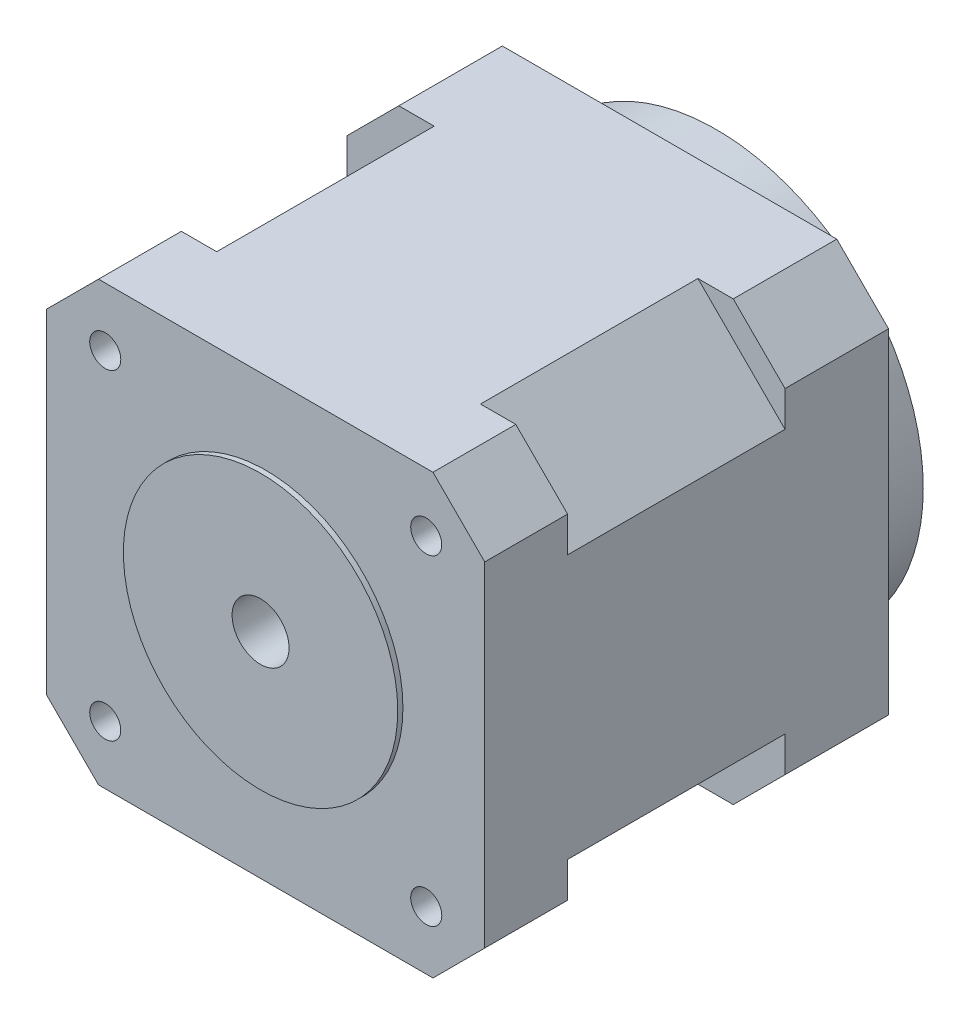
ISO-10303-21;
HEADER;
FILE_DESCRIPTION(('STEP AP214'),'2;1');
FILE_NAME('part.step','',(''),(''),'','','');
FILE_SCHEMA(('AUTOMOTIVE_DESIGN { 1 0 10303 214 1 1 1 1 }'));
ENDSEC;
DATA;
#1=APPLICATION_CONTEXT('core data for automotive mechanical design processes');
#2=APPLICATION_PROTOCOL_DEFINITION('international standard','automotive_design',2000,#1);
#3=PRODUCT_CONTEXT('',#1,'mechanical');
#4=PRODUCT('Part','Part','',(#3));
#5=PRODUCT_RELATED_PRODUCT_CATEGORY('part','',(#4));
#6=PRODUCT_DEFINITION_FORMATION('','',#4);
#7=PRODUCT_DEFINITION_CONTEXT('part definition',#1,'design');
#8=PRODUCT_DEFINITION('design','',#6,#7);
#9=PRODUCT_DEFINITION_SHAPE('','',#8);
#10=(LENGTH_UNIT() NAMED_UNIT(*) SI_UNIT(.MILLI.,.METRE.));
#11=(NAMED_UNIT(*) PLANE_ANGLE_UNIT() SI_UNIT($,.RADIAN.));
#12=(NAMED_UNIT(*) SI_UNIT($,.STERADIAN.) SOLID_ANGLE_UNIT());
#13=UNCERTAINTY_MEASURE_WITH_UNIT(LENGTH_MEASURE(1.E-05),#10,'distance_accuracy_value','');
#14=(GEOMETRIC_REPRESENTATION_CONTEXT(3) GLOBAL_UNCERTAINTY_ASSIGNED_CONTEXT((#13)) GLOBAL_UNIT_ASSIGNED_CONTEXT((#10,
#11,#12)) REPRESENTATION_CONTEXT('',''));
#15=CARTESIAN_POINT('',(0.,0.,0.));
#16=DIRECTION('',(0.,0.,1.));
#17=DIRECTION('',(1.,0.,0.));
#18=AXIS2_PLACEMENT_3D('',#15,#16,#17);
#19=CARTESIAN_POINT('',(21.15,-21.15,39.));
#20=DIRECTION('',(-1.,0.,0.));
#21=DIRECTION('',(0.,0.,1.));
#22=AXIS2_PLACEMENT_3D('',#19,#20,#21);
#23=PLANE('',#22);
#24=DIRECTION('',(0.,1.,0.));
#25=VECTOR('',#24,1.);
#26=CARTESIAN_POINT('',(21.15,21.15,10.));
#27=LINE('',#26,#25);
#28=CARTESIAN_POINT('',(21.15,12.7386403449672,10.));
#29=VERTEX_POINT('',#28);
#30=CARTESIAN_POINT('',(21.15,16.15,10.));
#31=VERTEX_POINT('',#30);
#32=EDGE_CURVE('E259',#29,#31,#27,.T.);
#33=ORIENTED_EDGE('',*,*,#32,.F.);
#34=DIRECTION('',(0.,0.,1.));
#35=VECTOR('',#34,1.);
#36=CARTESIAN_POINT('',(21.15,12.7386403449672,10.));
#37=LINE('',#36,#35);
#38=CARTESIAN_POINT('',(21.15,12.7386403449672,31.));
#39=VERTEX_POINT('',#38);
#40=EDGE_CURVE('E252',#29,#39,#37,.T.);
#41=ORIENTED_EDGE('',*,*,#40,.T.);
#42=DIRECTION('',(0.,1.,0.));
#43=VECTOR('',#42,1.);
#44=CARTESIAN_POINT('',(21.15,21.15,31.));
#45=LINE('',#44,#43);
#46=CARTESIAN_POINT('',(21.15,16.15,31.));
#47=VERTEX_POINT('',#46);
#48=EDGE_CURVE('E234',#39,#47,#45,.T.);
#49=ORIENTED_EDGE('',*,*,#48,.T.);
#50=DIRECTION('',(0.,0.,1.));
#51=VECTOR('',#50,1.);
#52=CARTESIAN_POINT('',(21.15,16.15,39.));
#53=LINE('',#52,#51);
#54=CARTESIAN_POINT('',(21.15,16.15,39.));
#55=VERTEX_POINT('',#54);
#56=EDGE_CURVE('E319',#47,#55,#53,.T.);
#57=ORIENTED_EDGE('',*,*,#56,.T.);
#58=DIRECTION('',(0.,1.,0.));
#59=VECTOR('',#58,1.);
#60=CARTESIAN_POINT('',(21.15,-21.15,39.));
#61=LINE('',#60,#59);
#62=CARTESIAN_POINT('',(21.15,-16.15,39.));
#63=VERTEX_POINT('',#62);
#64=EDGE_CURVE('E306',#63,#55,#61,.T.);
#65=ORIENTED_EDGE('',*,*,#64,.F.);
#66=DIRECTION('',(0.,0.,-1.));
#67=VECTOR('',#66,1.);
#68=CARTESIAN_POINT('',(21.15,-16.15,39.));
#69=LINE('',#68,#67);
#70=CARTESIAN_POINT('',(21.15,-16.15,31.));
#71=VERTEX_POINT('',#70);
#72=EDGE_CURVE('E334',#63,#71,#69,.T.);
#73=ORIENTED_EDGE('',*,*,#72,.T.);
#74=DIRECTION('',(0.,1.,0.));
#75=VECTOR('',#74,1.);
#76=CARTESIAN_POINT('',(21.15,-12.7386403449672,31.));
#77=LINE('',#76,#75);
#78=CARTESIAN_POINT('',(21.15,-12.7386403449672,31.));
#79=VERTEX_POINT('',#78);
#80=EDGE_CURVE('E66',#71,#79,#77,.T.);
#81=ORIENTED_EDGE('',*,*,#80,.T.);
#82=DIRECTION('',(0.,0.,1.));
#83=VECTOR('',#82,1.);
#84=CARTESIAN_POINT('',(21.15,-12.7386403449672,10.));
#85=LINE('',#84,#83);
#86=CARTESIAN_POINT('',(21.15,-12.7386403449672,10.));
#87=VERTEX_POINT('',#86);
#88=EDGE_CURVE('E228',#87,#79,#85,.T.);
#89=ORIENTED_EDGE('',*,*,#88,.F.);
#90=DIRECTION('',(0.,1.,0.));
#91=VECTOR('',#90,1.);
#92=CARTESIAN_POINT('',(21.15,-12.7386403449672,10.));
#93=LINE('',#92,#91);
#94=CARTESIAN_POINT('',(21.15,-16.15,10.));
#95=VERTEX_POINT('',#94);
#96=EDGE_CURVE('E245',#95,#87,#93,.T.);
#97=ORIENTED_EDGE('',*,*,#96,.F.);
#98=CARTESIAN_POINT('',(21.15,-16.15,0.));
#99=VERTEX_POINT('',#98);
#100=EDGE_CURVE('E333',#95,#99,#69,.T.);
#101=ORIENTED_EDGE('',*,*,#100,.T.);
#102=DIRECTION('',(0.,1.,0.));
#103=VECTOR('',#102,1.);
#104=CARTESIAN_POINT('',(21.15,-21.15,0.));
#105=LINE('',#104,#103);
#106=CARTESIAN_POINT('',(21.15,16.15,0.));
#107=VERTEX_POINT('',#106);
#108=EDGE_CURVE('E303',#99,#107,#105,.T.);
#109=ORIENTED_EDGE('',*,*,#108,.T.);
#110=EDGE_CURVE('E330',#107,#31,#53,.T.);
#111=ORIENTED_EDGE('',*,*,#110,.T.);
#112=EDGE_LOOP('',(#33,#41,#49,#57,#65,#73,#81,#89,#97,#101,#109,#111));
#113=FACE_BOUND('',#112,.T.);
#114=ADVANCED_FACE('F48',(#113),#23,.F.);
#115=CARTESIAN_POINT('',(-21.15,21.15,39.));
#116=DIRECTION('',(0.,-1.,0.));
#117=DIRECTION('',(0.,0.,-1.));
#118=AXIS2_PLACEMENT_3D('',#115,#116,#117);
#119=PLANE('',#118);
#120=DIRECTION('',(-1.,0.,0.));
#121=VECTOR('',#120,1.);
#122=CARTESIAN_POINT('',(12.7386403449672,21.15,10.));
#123=LINE('',#122,#121);
#124=CARTESIAN_POINT('',(16.15,21.15,10.));
#125=VERTEX_POINT('',#124);
#126=CARTESIAN_POINT('',(12.7386403449672,21.15,10.));
#127=VERTEX_POINT('',#126);
#128=EDGE_CURVE('E263',#125,#127,#123,.T.);
#129=ORIENTED_EDGE('',*,*,#128,.F.);
#130=DIRECTION('',(0.,0.,-1.));
#131=VECTOR('',#130,1.);
#132=CARTESIAN_POINT('',(16.15,21.15,39.));
#133=LINE('',#132,#131);
#134=CARTESIAN_POINT('',(16.15,21.15,0.));
#135=VERTEX_POINT('',#134);
#136=EDGE_CURVE('E368',#125,#135,#133,.T.);
#137=ORIENTED_EDGE('',*,*,#136,.T.);
#138=DIRECTION('',(-1.,0.,0.));
#139=VECTOR('',#138,1.);
#140=CARTESIAN_POINT('',(-21.15,21.15,0.));
#141=LINE('',#140,#139);
#142=CARTESIAN_POINT('',(-16.15,21.15,0.));
#143=VERTEX_POINT('',#142);
#144=EDGE_CURVE('E322',#135,#143,#141,.T.);
#145=ORIENTED_EDGE('',*,*,#144,.T.);
#146=DIRECTION('',(0.,0.,1.));
#147=VECTOR('',#146,1.);
#148=CARTESIAN_POINT('',(-16.15,21.15,39.));
#149=LINE('',#148,#147);
#150=CARTESIAN_POINT('',(-16.15,21.15,10.));
#151=VERTEX_POINT('',#150);
#152=EDGE_CURVE('E373',#143,#151,#149,.T.);
#153=ORIENTED_EDGE('',*,*,#152,.T.);
#154=DIRECTION('',(-1.,0.,0.));
#155=VECTOR('',#154,1.);
#156=CARTESIAN_POINT('',(-12.7386403449672,21.15,10.));
#157=LINE('',#156,#155);
#158=CARTESIAN_POINT('',(-12.7386403449672,21.15,10.));
#159=VERTEX_POINT('',#158);
#160=EDGE_CURVE('E285',#159,#151,#157,.T.);
#161=ORIENTED_EDGE('',*,*,#160,.F.);
#162=DIRECTION('',(0.,0.,1.));
#163=VECTOR('',#162,1.);
#164=CARTESIAN_POINT('',(-12.7386403449672,21.15,10.));
#165=LINE('',#164,#163);
#166=CARTESIAN_POINT('',(-12.7386403449672,21.15,31.));
#167=VERTEX_POINT('',#166);
#168=EDGE_CURVE('E300',#159,#167,#165,.T.);
#169=ORIENTED_EDGE('',*,*,#168,.T.);
#170=DIRECTION('',(-1.,0.,0.));
#171=VECTOR('',#170,1.);
#172=CARTESIAN_POINT('',(-12.7386403449672,21.15,31.));
#173=LINE('',#172,#171);
#174=CARTESIAN_POINT('',(-16.15,21.15,31.));
#175=VERTEX_POINT('',#174);
#176=EDGE_CURVE('E219',#167,#175,#173,.T.);
#177=ORIENTED_EDGE('',*,*,#176,.T.);
#178=CARTESIAN_POINT('',(-16.15,21.15,39.));
#179=VERTEX_POINT('',#178);
#180=EDGE_CURVE('E372',#175,#179,#149,.T.);
#181=ORIENTED_EDGE('',*,*,#180,.T.);
#182=DIRECTION('',(-1.,0.,0.));
#183=VECTOR('',#182,1.);
#184=CARTESIAN_POINT('',(-21.15,21.15,39.));
#185=LINE('',#184,#183);
#186=CARTESIAN_POINT('',(16.15,21.15,39.));
#187=VERTEX_POINT('',#186);
#188=EDGE_CURVE('E309',#187,#179,#185,.T.);
#189=ORIENTED_EDGE('',*,*,#188,.F.);
#190=CARTESIAN_POINT('',(16.15,21.15,31.));
#191=VERTEX_POINT('',#190);
#192=EDGE_CURVE('E369',#187,#191,#133,.T.);
#193=ORIENTED_EDGE('',*,*,#192,.T.);
#194=DIRECTION('',(-1.,0.,0.));
#195=VECTOR('',#194,1.);
#196=CARTESIAN_POINT('',(12.7386403449672,21.15,31.));
#197=LINE('',#196,#195);
#198=CARTESIAN_POINT('',(12.7386403449672,21.15,31.));
#199=VERTEX_POINT('',#198);
#200=EDGE_CURVE('E239',#191,#199,#197,.T.);
#201=ORIENTED_EDGE('',*,*,#200,.T.);
#202=DIRECTION('',(0.,0.,1.));
#203=VECTOR('',#202,1.);
#204=CARTESIAN_POINT('',(12.7386403449672,21.15,10.));
#205=LINE('',#204,#203);
#206=EDGE_CURVE('E248',#127,#199,#205,.T.);
#207=ORIENTED_EDGE('',*,*,#206,.F.);
#208=EDGE_LOOP('',(#129,#137,#145,#153,#161,#169,#177,#181,#189,#193,#201,#207));
#209=FACE_BOUND('',#208,.T.);
#210=ADVANCED_FACE('F450',(#209),#119,.F.);
#211=CARTESIAN_POINT('',(-21.15,-21.15,39.));
#212=DIRECTION('',(1.,0.,0.));
#213=DIRECTION('',(0.,0.,-1.));
#214=AXIS2_PLACEMENT_3D('',#211,#212,#213);
#215=PLANE('',#214);
#216=DIRECTION('',(0.,-1.,0.));
#217=VECTOR('',#216,1.);
#218=CARTESIAN_POINT('',(-21.15,-21.15,10.));
#219=LINE('',#218,#217);
#220=CARTESIAN_POINT('',(-21.15,-12.7386403449672,10.));
#221=VERTEX_POINT('',#220);
#222=CARTESIAN_POINT('',(-21.15,-16.15,10.));
#223=VERTEX_POINT('',#222);
#224=EDGE_CURVE('E277',#221,#223,#219,.T.);
#225=ORIENTED_EDGE('',*,*,#224,.F.);
#226=DIRECTION('',(0.,0.,1.));
#227=VECTOR('',#226,1.);
#228=CARTESIAN_POINT('',(-21.15,-12.7386403449672,10.));
#229=LINE('',#228,#227);
#230=CARTESIAN_POINT('',(-21.15,-12.7386403449672,31.));
#231=VERTEX_POINT('',#230);
#232=EDGE_CURVE('E270',#221,#231,#229,.T.);
#233=ORIENTED_EDGE('',*,*,#232,.T.);
#234=DIRECTION('',(0.,-1.,0.));
#235=VECTOR('',#234,1.);
#236=CARTESIAN_POINT('',(-21.15,-21.15,31.));
#237=LINE('',#236,#235);
#238=CARTESIAN_POINT('',(-21.15,-16.15,31.));
#239=VERTEX_POINT('',#238);
#240=EDGE_CURVE('E255',#231,#239,#237,.T.);
#241=ORIENTED_EDGE('',*,*,#240,.T.);
#242=DIRECTION('',(0.,0.,1.));
#243=VECTOR('',#242,1.);
#244=CARTESIAN_POINT('',(-21.15,-16.15,39.));
#245=LINE('',#244,#243);
#246=CARTESIAN_POINT('',(-21.15,-16.15,39.));
#247=VERTEX_POINT('',#246);
#248=EDGE_CURVE('E364',#239,#247,#245,.T.);
#249=ORIENTED_EDGE('',*,*,#248,.T.);
#250=DIRECTION('',(0.,-1.,0.));
#251=VECTOR('',#250,1.);
#252=CARTESIAN_POINT('',(-21.15,-21.15,39.));
#253=LINE('',#252,#251);
#254=CARTESIAN_POINT('',(-21.15,16.15,39.));
#255=VERTEX_POINT('',#254);
#256=EDGE_CURVE('E313',#255,#247,#253,.T.);
#257=ORIENTED_EDGE('',*,*,#256,.F.);
#258=DIRECTION('',(0.,0.,-1.));
#259=VECTOR('',#258,1.);
#260=CARTESIAN_POINT('',(-21.15,16.15,39.));
#261=LINE('',#260,#259);
#262=CARTESIAN_POINT('',(-21.15,16.15,31.));
#263=VERTEX_POINT('',#262);
#264=EDGE_CURVE('E361',#255,#263,#261,.T.);
#265=ORIENTED_EDGE('',*,*,#264,.T.);
#266=DIRECTION('',(0.,-1.,0.));
#267=VECTOR('',#266,1.);
#268=CARTESIAN_POINT('',(-21.15,21.15,31.));
#269=LINE('',#268,#267);
#270=CARTESIAN_POINT('',(-21.15,12.7386403449672,31.));
#271=VERTEX_POINT('',#270);
#272=EDGE_CURVE('E295',#263,#271,#269,.T.);
#273=ORIENTED_EDGE('',*,*,#272,.T.);
#274=DIRECTION('',(0.,0.,1.));
#275=VECTOR('',#274,1.);
#276=CARTESIAN_POINT('',(-21.15,12.7386403449672,10.));
#277=LINE('',#276,#275);
#278=CARTESIAN_POINT('',(-21.15,12.7386403449672,10.));
#279=VERTEX_POINT('',#278);
#280=EDGE_CURVE('E292',#279,#271,#277,.T.);
#281=ORIENTED_EDGE('',*,*,#280,.F.);
#282=DIRECTION('',(0.,-1.,0.));
#283=VECTOR('',#282,1.);
#284=CARTESIAN_POINT('',(-21.15,21.15,10.));
#285=LINE('',#284,#283);
#286=CARTESIAN_POINT('',(-21.15,16.15,10.));
#287=VERTEX_POINT('',#286);
#288=EDGE_CURVE('E287',#287,#279,#285,.T.);
#289=ORIENTED_EDGE('',*,*,#288,.F.);
#290=CARTESIAN_POINT('',(-21.15,16.15,0.));
#291=VERTEX_POINT('',#290);
#292=EDGE_CURVE('E360',#287,#291,#261,.T.);
#293=ORIENTED_EDGE('',*,*,#292,.T.);
#294=DIRECTION('',(0.,-1.,0.));
#295=VECTOR('',#294,1.);
#296=CARTESIAN_POINT('',(-21.15,-21.15,0.));
#297=LINE('',#296,#295);
#298=CARTESIAN_POINT('',(-21.15,-16.15,0.));
#299=VERTEX_POINT('',#298);
#300=EDGE_CURVE('E325',#291,#299,#297,.T.);
#301=ORIENTED_EDGE('',*,*,#300,.T.);
#302=EDGE_CURVE('E365',#299,#223,#245,.T.);
#303=ORIENTED_EDGE('',*,*,#302,.T.);
#304=EDGE_LOOP('',(#225,#233,#241,#249,#257,#265,#273,#281,#289,#293,#301,#303));
#305=FACE_BOUND('',#304,.T.);
#306=ADVANCED_FACE('F456',(#305),#215,.F.);
#307=CARTESIAN_POINT('',(-21.15,-21.15,39.));
#308=DIRECTION('',(0.,1.,0.));
#309=DIRECTION('',(0.,0.,1.));
#310=AXIS2_PLACEMENT_3D('',#307,#308,#309);
#311=PLANE('',#310);
#312=DIRECTION('',(1.,0.,0.));
#313=VECTOR('',#312,1.);
#314=CARTESIAN_POINT('',(-12.7386403449672,-21.15,10.));
#315=LINE('',#314,#313);
#316=CARTESIAN_POINT('',(-16.15,-21.15,10.));
#317=VERTEX_POINT('',#316);
#318=CARTESIAN_POINT('',(-12.7386403449672,-21.15,10.));
#319=VERTEX_POINT('',#318);
#320=EDGE_CURVE('E282',#317,#319,#315,.T.);
#321=ORIENTED_EDGE('',*,*,#320,.F.);
#322=DIRECTION('',(0.,0.,-1.));
#323=VECTOR('',#322,1.);
#324=CARTESIAN_POINT('',(-16.15,-21.15,39.));
#325=LINE('',#324,#323);
#326=CARTESIAN_POINT('',(-16.15,-21.15,0.));
#327=VERTEX_POINT('',#326);
#328=EDGE_CURVE('E345',#317,#327,#325,.T.);
#329=ORIENTED_EDGE('',*,*,#328,.T.);
#330=DIRECTION('',(1.,0.,0.));
#331=VECTOR('',#330,1.);
#332=CARTESIAN_POINT('',(-21.15,-21.15,0.));
#333=LINE('',#332,#331);
#334=CARTESIAN_POINT('',(16.15,-21.15,0.));
#335=VERTEX_POINT('',#334);
#336=EDGE_CURVE('E310',#327,#335,#333,.T.);
#337=ORIENTED_EDGE('',*,*,#336,.T.);
#338=DIRECTION('',(0.,0.,1.));
#339=VECTOR('',#338,1.);
#340=CARTESIAN_POINT('',(16.15,-21.15,39.));
#341=LINE('',#340,#339);
#342=CARTESIAN_POINT('',(16.15,-21.15,10.));
#343=VERTEX_POINT('',#342);
#344=EDGE_CURVE('E350',#335,#343,#341,.T.);
#345=ORIENTED_EDGE('',*,*,#344,.T.);
#346=DIRECTION('',(1.,0.,0.));
#347=VECTOR('',#346,1.);
#348=CARTESIAN_POINT('',(21.15,-21.15,10.));
#349=LINE('',#348,#347);
#350=CARTESIAN_POINT('',(12.7386403449672,-21.15,10.));
#351=VERTEX_POINT('',#350);
#352=EDGE_CURVE('E229',#351,#343,#349,.T.);
#353=ORIENTED_EDGE('',*,*,#352,.F.);
#354=DIRECTION('',(0.,0.,1.));
#355=VECTOR('',#354,1.);
#356=CARTESIAN_POINT('',(12.7386403449672,-21.15,10.));
#357=LINE('',#356,#355);
#358=CARTESIAN_POINT('',(12.7386403449672,-21.15,31.));
#359=VERTEX_POINT('',#358);
#360=EDGE_CURVE('E225',#351,#359,#357,.T.);
#361=ORIENTED_EDGE('',*,*,#360,.T.);
#362=DIRECTION('',(1.,0.,0.));
#363=VECTOR('',#362,1.);
#364=CARTESIAN_POINT('',(21.15,-21.15,31.));
#365=LINE('',#364,#363);
#366=CARTESIAN_POINT('',(16.15,-21.15,31.));
#367=VERTEX_POINT('',#366);
#368=EDGE_CURVE('E210',#359,#367,#365,.T.);
#369=ORIENTED_EDGE('',*,*,#368,.T.);
#370=CARTESIAN_POINT('',(16.15,-21.15,39.));
#371=VERTEX_POINT('',#370);
#372=EDGE_CURVE('E349',#367,#371,#341,.T.);
#373=ORIENTED_EDGE('',*,*,#372,.T.);
#374=DIRECTION('',(1.,0.,0.));
#375=VECTOR('',#374,1.);
#376=CARTESIAN_POINT('',(-21.15,-21.15,39.));
#377=LINE('',#376,#375);
#378=CARTESIAN_POINT('',(-16.15,-21.15,39.));
#379=VERTEX_POINT('',#378);
#380=EDGE_CURVE('E316',#379,#371,#377,.T.);
#381=ORIENTED_EDGE('',*,*,#380,.F.);
#382=CARTESIAN_POINT('',(-16.15,-21.15,31.));
#383=VERTEX_POINT('',#382);
#384=EDGE_CURVE('E346',#379,#383,#325,.T.);
#385=ORIENTED_EDGE('',*,*,#384,.T.);
#386=DIRECTION('',(1.,0.,0.));
#387=VECTOR('',#386,1.);
#388=CARTESIAN_POINT('',(-12.7386403449672,-21.15,31.));
#389=LINE('',#388,#387);
#390=CARTESIAN_POINT('',(-12.7386403449672,-21.15,31.));
#391=VERTEX_POINT('',#390);
#392=EDGE_CURVE('E74',#383,#391,#389,.T.);
#393=ORIENTED_EDGE('',*,*,#392,.T.);
#394=DIRECTION('',(0.,0.,1.));
#395=VECTOR('',#394,1.);
#396=CARTESIAN_POINT('',(-12.7386403449672,-21.15,10.));
#397=LINE('',#396,#395);
#398=EDGE_CURVE('E266',#319,#391,#397,.T.);
#399=ORIENTED_EDGE('',*,*,#398,.F.);
#400=EDGE_LOOP('',(#321,#329,#337,#345,#353,#361,#369,#373,#381,#385,#393,#399));
#401=FACE_BOUND('',#400,.T.);
#402=ADVANCED_FACE('F232',(#401),#311,.F.);
#403=CARTESIAN_POINT('',(21.15,-16.15,39.));
#404=DIRECTION('',(-0.707106781186547,0.707106781186549,0.));
#405=DIRECTION('',(0.,0.,-1.));
#406=AXIS2_PLACEMENT_3D('',#403,#404,#405);
#407=PLANE('',#406);
#408=ORIENTED_EDGE('',*,*,#100,.F.);
#409=DIRECTION('',(0.707106781186549,0.707106781186547,0.));
#410=VECTOR('',#409,1.);
#411=CARTESIAN_POINT('',(21.15,-16.15,10.));
#412=LINE('',#411,#410);
#413=EDGE_CURVE('E53',#95,#343,#412,.F.);
#414=ORIENTED_EDGE('',*,*,#413,.T.);
#415=ORIENTED_EDGE('',*,*,#344,.F.);
#416=DIRECTION('',(0.707106781186549,0.707106781186547,0.));
#417=VECTOR('',#416,1.);
#418=CARTESIAN_POINT('',(18.65,-18.65,0.));
#419=LINE('',#418,#417);
#420=EDGE_CURVE('E343',#99,#335,#419,.F.);
#421=ORIENTED_EDGE('',*,*,#420,.F.);
#422=EDGE_LOOP('',(#408,#414,#415,#421));
#423=FACE_BOUND('',#422,.T.);
#424=ADVANCED_FACE('F472',(#423),#407,.F.);
#425=CARTESIAN_POINT('',(-16.15,-21.15,39.));
#426=DIRECTION('',(0.707106781186549,0.707106781186546,0.));
#427=DIRECTION('',(0.,0.,-1.));
#428=AXIS2_PLACEMENT_3D('',#425,#426,#427);
#429=PLANE('',#428);
#430=ORIENTED_EDGE('',*,*,#328,.F.);
#431=DIRECTION('',(0.707106781186546,-0.707106781186549,0.));
#432=VECTOR('',#431,1.);
#433=CARTESIAN_POINT('',(-16.15,-21.15,10.));
#434=LINE('',#433,#432);
#435=EDGE_CURVE('E388',#317,#223,#434,.F.);
#436=ORIENTED_EDGE('',*,*,#435,.T.);
#437=ORIENTED_EDGE('',*,*,#302,.F.);
#438=DIRECTION('',(0.707106781186546,-0.707106781186549,0.));
#439=VECTOR('',#438,1.);
#440=CARTESIAN_POINT('',(-18.65,-18.65,0.));
#441=LINE('',#440,#439);
#442=EDGE_CURVE('E341',#327,#299,#441,.F.);
#443=ORIENTED_EDGE('',*,*,#442,.F.);
#444=EDGE_LOOP('',(#430,#436,#437,#443));
#445=FACE_BOUND('',#444,.T.);
#446=ADVANCED_FACE('F479',(#445),#429,.F.);
#447=CARTESIAN_POINT('',(-21.15,16.15,39.));
#448=DIRECTION('',(0.707106781186546,-0.707106781186549,0.));
#449=DIRECTION('',(0.,0.,-1.));
#450=AXIS2_PLACEMENT_3D('',#447,#448,#449);
#451=PLANE('',#450);
#452=ORIENTED_EDGE('',*,*,#292,.F.);
#453=DIRECTION('',(-0.707106781186549,-0.707106781186546,0.));
#454=VECTOR('',#453,1.);
#455=CARTESIAN_POINT('',(-21.15,16.15,10.));
#456=LINE('',#455,#454);
#457=EDGE_CURVE('E383',#287,#151,#456,.F.);
#458=ORIENTED_EDGE('',*,*,#457,.T.);
#459=ORIENTED_EDGE('',*,*,#152,.F.);
#460=DIRECTION('',(-0.707106781186549,-0.707106781186546,0.));
#461=VECTOR('',#460,1.);
#462=CARTESIAN_POINT('',(-18.65,18.65,0.));
#463=LINE('',#462,#461);
#464=EDGE_CURVE('E339',#291,#143,#463,.F.);
#465=ORIENTED_EDGE('',*,*,#464,.F.);
#466=EDGE_LOOP('',(#452,#458,#459,#465));
#467=FACE_BOUND('',#466,.T.);
#468=ADVANCED_FACE('F484',(#467),#451,.F.);
#469=CARTESIAN_POINT('',(16.15,21.15,39.));
#470=DIRECTION('',(-0.707106781186548,-0.707106781186546,0.));
#471=DIRECTION('',(0.,0.,-1.));
#472=AXIS2_PLACEMENT_3D('',#469,#470,#471);
#473=PLANE('',#472);
#474=ORIENTED_EDGE('',*,*,#136,.F.);
#475=DIRECTION('',(-0.707106781186547,0.707106781186549,0.));
#476=VECTOR('',#475,1.);
#477=CARTESIAN_POINT('',(16.15,21.15,10.));
#478=LINE('',#477,#476);
#479=EDGE_CURVE('E378',#125,#31,#478,.F.);
#480=ORIENTED_EDGE('',*,*,#479,.T.);
#481=ORIENTED_EDGE('',*,*,#110,.F.);
#482=DIRECTION('',(-0.707106781186547,0.707106781186549,0.));
#483=VECTOR('',#482,1.);
#484=CARTESIAN_POINT('',(18.65,18.65,0.));
#485=LINE('',#484,#483);
#486=EDGE_CURVE('E337',#135,#107,#485,.F.);
#487=ORIENTED_EDGE('',*,*,#486,.F.);
#488=EDGE_LOOP('',(#474,#480,#481,#487));
#489=FACE_BOUND('',#488,.T.);
#490=ADVANCED_FACE('F490',(#489),#473,.F.);
#491=CARTESIAN_POINT('',(0.,0.,39.));
#492=DIRECTION('',(0.,0.,-1.));
#493=DIRECTION('',(-1.,0.,0.));
#494=AXIS2_PLACEMENT_3D('',#491,#492,#493);
#495=PLANE('',#494);
#496=CARTESIAN_POINT('',(0.,0.,39.));
#497=DIRECTION('',(0.,0.,1.));
#498=DIRECTION('',(1.,0.,0.));
#499=AXIS2_PLACEMENT_3D('',#496,#497,#498);
#500=CIRCLE('',#499,13.2479305499633);
#501=CARTESIAN_POINT('',(13.2479305499633,0.,39.));
#502=VERTEX_POINT('',#501);
#503=EDGE_CURVE('E11',#502,#502,#500,.T.);
#504=ORIENTED_EDGE('',*,*,#503,.F.);
#505=EDGE_LOOP('',(#504));
#506=FACE_BOUND('',#505,.T.);
#507=CARTESIAN_POINT('',(-15.5,-15.5,39.));
#508=DIRECTION('',(0.,0.,1.));
#509=DIRECTION('',(-1.,0.,0.));
#510=AXIS2_PLACEMENT_3D('',#507,#508,#509);
#511=CIRCLE('',#510,1.5);
#512=CARTESIAN_POINT('',(-17.,-15.5,39.));
#513=VERTEX_POINT('',#512);
#514=EDGE_CURVE('E404',#513,#513,#511,.T.);
#515=ORIENTED_EDGE('',*,*,#514,.F.);
#516=EDGE_LOOP('',(#515));
#517=FACE_BOUND('',#516,.T.);
#518=CARTESIAN_POINT('',(15.5,15.5,39.));
#519=DIRECTION('',(0.,0.,1.));
#520=DIRECTION('',(-1.,0.,0.));
#521=AXIS2_PLACEMENT_3D('',#518,#519,#520);
#522=CIRCLE('',#521,1.5);
#523=CARTESIAN_POINT('',(14.,15.5,39.));
#524=VERTEX_POINT('',#523);
#525=EDGE_CURVE('E410',#524,#524,#522,.T.);
#526=ORIENTED_EDGE('',*,*,#525,.F.);
#527=EDGE_LOOP('',(#526));
#528=FACE_BOUND('',#527,.T.);
#529=CARTESIAN_POINT('',(15.5,-15.5,39.));
#530=DIRECTION('',(0.,0.,1.));
#531=DIRECTION('',(1.,0.,0.));
#532=AXIS2_PLACEMENT_3D('',#529,#530,#531);
#533=CIRCLE('',#532,1.5);
#534=CARTESIAN_POINT('',(17.,-15.5,39.));
#535=VERTEX_POINT('',#534);
#536=EDGE_CURVE('E411',#535,#535,#533,.T.);
#537=ORIENTED_EDGE('',*,*,#536,.F.);
#538=EDGE_LOOP('',(#537));
#539=FACE_BOUND('',#538,.T.);
#540=CARTESIAN_POINT('',(-15.5,15.5,39.));
#541=DIRECTION('',(0.,0.,1.));
#542=DIRECTION('',(1.,0.,0.));
#543=AXIS2_PLACEMENT_3D('',#540,#541,#542);
#544=CIRCLE('',#543,1.5);
#545=CARTESIAN_POINT('',(-14.,15.5,39.));
#546=VERTEX_POINT('',#545);
#547=EDGE_CURVE('E401',#546,#546,#544,.T.);
#548=ORIENTED_EDGE('',*,*,#547,.F.);
#549=EDGE_LOOP('',(#548));
#550=FACE_BOUND('',#549,.T.);
#551=ORIENTED_EDGE('',*,*,#380,.T.);
#552=DIRECTION('',(-0.707106781186549,-0.707106781186547,0.));
#553=VECTOR('',#552,1.);
#554=CARTESIAN_POINT('',(21.15,-16.15,39.));
#555=LINE('',#554,#553);
#556=EDGE_CURVE('E358',#371,#63,#555,.F.);
#557=ORIENTED_EDGE('',*,*,#556,.T.);
#558=ORIENTED_EDGE('',*,*,#64,.T.);
#559=DIRECTION('',(0.707106781186547,-0.707106781186549,0.));
#560=VECTOR('',#559,1.);
#561=CARTESIAN_POINT('',(16.15,21.15,39.));
#562=LINE('',#561,#560);
#563=EDGE_CURVE('E352',#55,#187,#562,.F.);
#564=ORIENTED_EDGE('',*,*,#563,.T.);
#565=ORIENTED_EDGE('',*,*,#188,.T.);
#566=DIRECTION('',(0.707106781186549,0.707106781186546,0.));
#567=VECTOR('',#566,1.);
#568=CARTESIAN_POINT('',(-21.15,16.15,39.));
#569=LINE('',#568,#567);
#570=EDGE_CURVE('E354',#179,#255,#569,.F.);
#571=ORIENTED_EDGE('',*,*,#570,.T.);
#572=ORIENTED_EDGE('',*,*,#256,.T.);
#573=DIRECTION('',(-0.707106781186546,0.707106781186549,0.));
#574=VECTOR('',#573,1.);
#575=CARTESIAN_POINT('',(-16.15,-21.15,39.));
#576=LINE('',#575,#574);
#577=EDGE_CURVE('E356',#247,#379,#576,.F.);
#578=ORIENTED_EDGE('',*,*,#577,.T.);
#579=EDGE_LOOP('',(#551,#557,#558,#564,#565,#571,#572,#578));
#580=FACE_BOUND('',#579,.T.);
#581=ADVANCED_FACE('F498',(#506,#517,#528,#539,#550,#580),#495,.F.);
#582=CARTESIAN_POINT('',(0.,0.,0.));
#583=DIRECTION('',(0.,0.,-1.));
#584=DIRECTION('',(-1.,0.,0.));
#585=AXIS2_PLACEMENT_3D('',#582,#583,#584);
#586=PLANE('',#585);
#587=CARTESIAN_POINT('',(0.,0.,0.));
#588=DIRECTION('',(0.,0.,-1.));
#589=DIRECTION('',(-1.,0.,0.));
#590=AXIS2_PLACEMENT_3D('',#587,#588,#589);
#591=CIRCLE('',#590,20.);
#592=CARTESIAN_POINT('',(-20.,0.,0.));
#593=VERTEX_POINT('',#592);
#594=EDGE_CURVE('E58',#593,#593,#591,.T.);
#595=ORIENTED_EDGE('',*,*,#594,.F.);
#596=EDGE_LOOP('',(#595));
#597=FACE_BOUND('',#596,.T.);
#598=ORIENTED_EDGE('',*,*,#108,.F.);
#599=ORIENTED_EDGE('',*,*,#420,.T.);
#600=ORIENTED_EDGE('',*,*,#336,.F.);
#601=ORIENTED_EDGE('',*,*,#442,.T.);
#602=ORIENTED_EDGE('',*,*,#300,.F.);
#603=ORIENTED_EDGE('',*,*,#464,.T.);
#604=ORIENTED_EDGE('',*,*,#144,.F.);
#605=ORIENTED_EDGE('',*,*,#486,.T.);
#606=EDGE_LOOP('',(#598,#599,#600,#601,#602,#603,#604,#605));
#607=FACE_BOUND('',#606,.T.);
#608=ADVANCED_FACE('F470',(#597,#607),#586,.T.);
#609=DIRECTION('',(0.707106781186549,0.707106781186547,0.));
#610=VECTOR('',#609,1.);
#611=CARTESIAN_POINT('',(21.15,-16.15,31.));
#612=LINE('',#611,#610);
#613=EDGE_CURVE('E215',#71,#367,#612,.F.);
#614=ORIENTED_EDGE('',*,*,#613,.F.);
#615=ORIENTED_EDGE('',*,*,#72,.F.);
#616=ORIENTED_EDGE('',*,*,#556,.F.);
#617=ORIENTED_EDGE('',*,*,#372,.F.);
#618=EDGE_LOOP('',(#614,#615,#616,#617));
#619=FACE_BOUND('',#618,.T.);
#620=ADVANCED_FACE('F463',(#619),#407,.F.);
#621=DIRECTION('',(0.707106781186546,-0.707106781186549,0.));
#622=VECTOR('',#621,1.);
#623=CARTESIAN_POINT('',(-16.15,-21.15,31.));
#624=LINE('',#623,#622);
#625=EDGE_CURVE('E386',#383,#239,#624,.F.);
#626=ORIENTED_EDGE('',*,*,#625,.F.);
#627=ORIENTED_EDGE('',*,*,#384,.F.);
#628=ORIENTED_EDGE('',*,*,#577,.F.);
#629=ORIENTED_EDGE('',*,*,#248,.F.);
#630=EDGE_LOOP('',(#626,#627,#628,#629));
#631=FACE_BOUND('',#630,.T.);
#632=ADVANCED_FACE('F469',(#631),#429,.F.);
#633=DIRECTION('',(-0.707106781186549,-0.707106781186546,0.));
#634=VECTOR('',#633,1.);
#635=CARTESIAN_POINT('',(-21.15,16.15,31.));
#636=LINE('',#635,#634);
#637=EDGE_CURVE('E381',#263,#175,#636,.F.);
#638=ORIENTED_EDGE('',*,*,#637,.F.);
#639=ORIENTED_EDGE('',*,*,#264,.F.);
#640=ORIENTED_EDGE('',*,*,#570,.F.);
#641=ORIENTED_EDGE('',*,*,#180,.F.);
#642=EDGE_LOOP('',(#638,#639,#640,#641));
#643=FACE_BOUND('',#642,.T.);
#644=ADVANCED_FACE('F477',(#643),#451,.F.);
#645=DIRECTION('',(-0.707106781186547,0.707106781186549,0.));
#646=VECTOR('',#645,1.);
#647=CARTESIAN_POINT('',(16.15,21.15,31.));
#648=LINE('',#647,#646);
#649=EDGE_CURVE('E376',#191,#47,#648,.F.);
#650=ORIENTED_EDGE('',*,*,#649,.F.);
#651=ORIENTED_EDGE('',*,*,#192,.F.);
#652=ORIENTED_EDGE('',*,*,#563,.F.);
#653=ORIENTED_EDGE('',*,*,#56,.F.);
#654=EDGE_LOOP('',(#650,#651,#652,#653));
#655=FACE_BOUND('',#654,.T.);
#656=ADVANCED_FACE('F51',(#655),#473,.F.);
#657=CARTESIAN_POINT('',(21.15,12.7386403449672,10.));
#658=DIRECTION('',(-0.707106781186548,-0.707106781186547,0.));
#659=DIRECTION('',(0.707106781186547,-0.707106781186548,0.));
#660=AXIS2_PLACEMENT_3D('',#657,#658,#659);
#661=PLANE('',#660);
#662=DIRECTION('',(0.707106781186547,-0.707106781186548,0.));
#663=VECTOR('',#662,1.);
#664=CARTESIAN_POINT('',(21.15,12.7386403449672,31.));
#665=LINE('',#664,#663);
#666=EDGE_CURVE('E256',#199,#39,#665,.T.);
#667=ORIENTED_EDGE('',*,*,#666,.T.);
#668=ORIENTED_EDGE('',*,*,#40,.F.);
#669=DIRECTION('',(0.707106781186548,-0.707106781186547,0.));
#670=VECTOR('',#669,1.);
#671=CARTESIAN_POINT('',(16.9443201724836,16.9443201724836,10.));
#672=LINE('',#671,#670);
#673=EDGE_CURVE('E251',#127,#29,#672,.T.);
#674=ORIENTED_EDGE('',*,*,#673,.F.);
#675=ORIENTED_EDGE('',*,*,#206,.T.);
#676=EDGE_LOOP('',(#667,#668,#674,#675));
#677=FACE_BOUND('',#676,.T.);
#678=ADVANCED_FACE('F488',(#677),#661,.F.);
#679=CARTESIAN_POINT('',(0.,0.,10.));
#680=DIRECTION('',(0.,0.,1.));
#681=DIRECTION('',(1.,0.,0.));
#682=AXIS2_PLACEMENT_3D('',#679,#680,#681);
#683=PLANE('',#682);
#684=ORIENTED_EDGE('',*,*,#128,.T.);
#685=ORIENTED_EDGE('',*,*,#673,.T.);
#686=ORIENTED_EDGE('',*,*,#32,.T.);
#687=ORIENTED_EDGE('',*,*,#479,.F.);
#688=EDGE_LOOP('',(#684,#685,#686,#687));
#689=FACE_BOUND('',#688,.T.);
#690=ADVANCED_FACE('F822',(#689),#683,.T.);
#691=CARTESIAN_POINT('',(0.,0.,31.));
#692=DIRECTION('',(0.,0.,1.));
#693=DIRECTION('',(1.,0.,0.));
#694=AXIS2_PLACEMENT_3D('',#691,#692,#693);
#695=PLANE('',#694);
#696=ORIENTED_EDGE('',*,*,#649,.T.);
#697=ORIENTED_EDGE('',*,*,#48,.F.);
#698=ORIENTED_EDGE('',*,*,#666,.F.);
#699=ORIENTED_EDGE('',*,*,#200,.F.);
#700=EDGE_LOOP('',(#696,#697,#698,#699));
#701=FACE_BOUND('',#700,.T.);
#702=ADVANCED_FACE('F565',(#701),#695,.F.);
#703=CARTESIAN_POINT('',(-16.9443201724836,16.9443201724836,10.));
#704=DIRECTION('',(0.707106781186547,-0.707106781186547,0.));
#705=DIRECTION('',(0.707106781186548,0.707106781186547,0.));
#706=AXIS2_PLACEMENT_3D('',#703,#704,#705);
#707=PLANE('',#706);
#708=DIRECTION('',(0.707106781186548,0.707106781186547,0.));
#709=VECTOR('',#708,1.);
#710=CARTESIAN_POINT('',(-16.9443201724836,16.9443201724836,31.));
#711=LINE('',#710,#709);
#712=EDGE_CURVE('E288',#271,#167,#711,.T.);
#713=ORIENTED_EDGE('',*,*,#712,.T.);
#714=ORIENTED_EDGE('',*,*,#168,.F.);
#715=DIRECTION('',(0.707106781186547,0.707106781186548,0.));
#716=VECTOR('',#715,1.);
#717=CARTESIAN_POINT('',(-21.15,12.7386403449672,10.));
#718=LINE('',#717,#716);
#719=EDGE_CURVE('E290',#279,#159,#718,.T.);
#720=ORIENTED_EDGE('',*,*,#719,.F.);
#721=ORIENTED_EDGE('',*,*,#280,.T.);
#722=EDGE_LOOP('',(#713,#714,#720,#721));
#723=FACE_BOUND('',#722,.T.);
#724=ADVANCED_FACE('F515',(#723),#707,.F.);
#725=CARTESIAN_POINT('',(0.,0.,10.));
#726=DIRECTION('',(0.,0.,1.));
#727=DIRECTION('',(1.,0.,0.));
#728=AXIS2_PLACEMENT_3D('',#725,#726,#727);
#729=PLANE('',#728);
#730=ORIENTED_EDGE('',*,*,#288,.T.);
#731=ORIENTED_EDGE('',*,*,#719,.T.);
#732=ORIENTED_EDGE('',*,*,#160,.T.);
#733=ORIENTED_EDGE('',*,*,#457,.F.);
#734=EDGE_LOOP('',(#730,#731,#732,#733));
#735=FACE_BOUND('',#734,.T.);
#736=ADVANCED_FACE('F512',(#735),#729,.T.);
#737=CARTESIAN_POINT('',(0.,0.,31.));
#738=DIRECTION('',(0.,0.,1.));
#739=DIRECTION('',(1.,0.,0.));
#740=AXIS2_PLACEMENT_3D('',#737,#738,#739);
#741=PLANE('',#740);
#742=ORIENTED_EDGE('',*,*,#637,.T.);
#743=ORIENTED_EDGE('',*,*,#176,.F.);
#744=ORIENTED_EDGE('',*,*,#712,.F.);
#745=ORIENTED_EDGE('',*,*,#272,.F.);
#746=EDGE_LOOP('',(#742,#743,#744,#745));
#747=FACE_BOUND('',#746,.T.);
#748=ADVANCED_FACE('F552',(#747),#741,.F.);
#749=CARTESIAN_POINT('',(-21.15,-12.7386403449672,10.));
#750=DIRECTION('',(0.707106781186547,0.707106781186548,0.));
#751=DIRECTION('',(-0.707106781186548,0.707106781186547,0.));
#752=AXIS2_PLACEMENT_3D('',#749,#750,#751);
#753=PLANE('',#752);
#754=DIRECTION('',(-0.707106781186548,0.707106781186547,0.));
#755=VECTOR('',#754,1.);
#756=CARTESIAN_POINT('',(-21.15,-12.7386403449672,31.));
#757=LINE('',#756,#755);
#758=EDGE_CURVE('E274',#391,#231,#757,.T.);
#759=ORIENTED_EDGE('',*,*,#758,.T.);
#760=ORIENTED_EDGE('',*,*,#232,.F.);
#761=DIRECTION('',(-0.707106781186547,0.707106781186548,0.));
#762=VECTOR('',#761,1.);
#763=CARTESIAN_POINT('',(-16.9443201724836,-16.9443201724836,10.));
#764=LINE('',#763,#762);
#765=EDGE_CURVE('E269',#319,#221,#764,.T.);
#766=ORIENTED_EDGE('',*,*,#765,.F.);
#767=ORIENTED_EDGE('',*,*,#398,.T.);
#768=EDGE_LOOP('',(#759,#760,#766,#767));
#769=FACE_BOUND('',#768,.T.);
#770=ADVANCED_FACE('F532',(#769),#753,.F.);
#771=CARTESIAN_POINT('',(0.,0.,10.));
#772=DIRECTION('',(0.,0.,1.));
#773=DIRECTION('',(1.,0.,0.));
#774=AXIS2_PLACEMENT_3D('',#771,#772,#773);
#775=PLANE('',#774);
#776=ORIENTED_EDGE('',*,*,#320,.T.);
#777=ORIENTED_EDGE('',*,*,#765,.T.);
#778=ORIENTED_EDGE('',*,*,#224,.T.);
#779=ORIENTED_EDGE('',*,*,#435,.F.);
#780=EDGE_LOOP('',(#776,#777,#778,#779));
#781=FACE_BOUND('',#780,.T.);
#782=ADVANCED_FACE('F528',(#781),#775,.T.);
#783=CARTESIAN_POINT('',(0.,0.,31.));
#784=DIRECTION('',(0.,0.,1.));
#785=DIRECTION('',(1.,0.,0.));
#786=AXIS2_PLACEMENT_3D('',#783,#784,#785);
#787=PLANE('',#786);
#788=ORIENTED_EDGE('',*,*,#625,.T.);
#789=ORIENTED_EDGE('',*,*,#240,.F.);
#790=ORIENTED_EDGE('',*,*,#758,.F.);
#791=ORIENTED_EDGE('',*,*,#392,.F.);
#792=EDGE_LOOP('',(#788,#789,#790,#791));
#793=FACE_BOUND('',#792,.T.);
#794=ADVANCED_FACE('F533',(#793),#787,.F.);
#795=CARTESIAN_POINT('',(12.7386403449672,-21.15,10.));
#796=DIRECTION('',(-0.707106781186548,0.707106781186547,0.));
#797=DIRECTION('',(-0.707106781186547,-0.707106781186548,0.));
#798=AXIS2_PLACEMENT_3D('',#795,#796,#797);
#799=PLANE('',#798);
#800=DIRECTION('',(-0.707106781186547,-0.707106781186548,0.));
#801=VECTOR('',#800,1.);
#802=CARTESIAN_POINT('',(12.7386403449672,-21.15,31.));
#803=LINE('',#802,#801);
#804=EDGE_CURVE('E213',#79,#359,#803,.T.);
#805=ORIENTED_EDGE('',*,*,#804,.T.);
#806=ORIENTED_EDGE('',*,*,#360,.F.);
#807=DIRECTION('',(-0.707106781186548,-0.707106781186547,0.));
#808=VECTOR('',#807,1.);
#809=CARTESIAN_POINT('',(16.9443201724836,-16.9443201724836,10.));
#810=LINE('',#809,#808);
#811=EDGE_CURVE('E236',#87,#351,#810,.T.);
#812=ORIENTED_EDGE('',*,*,#811,.F.);
#813=ORIENTED_EDGE('',*,*,#88,.T.);
#814=EDGE_LOOP('',(#805,#806,#812,#813));
#815=FACE_BOUND('',#814,.T.);
#816=ADVANCED_FACE('F223',(#815),#799,.F.);
#817=CARTESIAN_POINT('',(0.,0.,10.));
#818=DIRECTION('',(0.,0.,1.));
#819=DIRECTION('',(1.,0.,0.));
#820=AXIS2_PLACEMENT_3D('',#817,#818,#819);
#821=PLANE('',#820);
#822=ORIENTED_EDGE('',*,*,#96,.T.);
#823=ORIENTED_EDGE('',*,*,#811,.T.);
#824=ORIENTED_EDGE('',*,*,#352,.T.);
#825=ORIENTED_EDGE('',*,*,#413,.F.);
#826=EDGE_LOOP('',(#822,#823,#824,#825));
#827=FACE_BOUND('',#826,.T.);
#828=ADVANCED_FACE('F764',(#827),#821,.T.);
#829=CARTESIAN_POINT('',(0.,0.,31.));
#830=DIRECTION('',(0.,0.,1.));
#831=DIRECTION('',(1.,0.,0.));
#832=AXIS2_PLACEMENT_3D('',#829,#830,#831);
#833=PLANE('',#832);
#834=ORIENTED_EDGE('',*,*,#613,.T.);
#835=ORIENTED_EDGE('',*,*,#368,.F.);
#836=ORIENTED_EDGE('',*,*,#804,.F.);
#837=ORIENTED_EDGE('',*,*,#80,.F.);
#838=EDGE_LOOP('',(#834,#835,#836,#837));
#839=FACE_BOUND('',#838,.T.);
#840=ADVANCED_FACE('F212',(#839),#833,.F.);
#841=CARTESIAN_POINT('',(0.,0.,-4.5));
#842=DIRECTION('',(0.,0.,1.));
#843=DIRECTION('',(1.,0.,0.));
#844=AXIS2_PLACEMENT_3D('',#841,#842,#843);
#845=CYLINDRICAL_SURFACE('',#844,20.);
#846=CARTESIAN_POINT('',(0.,0.,-4.5));
#847=DIRECTION('',(0.,0.,-1.));
#848=DIRECTION('',(-1.,0.,0.));
#849=AXIS2_PLACEMENT_3D('',#846,#847,#848);
#850=CIRCLE('',#849,20.);
#851=CARTESIAN_POINT('',(-20.,0.,-4.5));
#852=VERTEX_POINT('',#851);
#853=EDGE_CURVE('E273',#852,#852,#850,.T.);
#854=ORIENTED_EDGE('',*,*,#853,.F.);
#855=EDGE_LOOP('',(#854));
#856=FACE_BOUND('',#855,.T.);
#857=ORIENTED_EDGE('',*,*,#594,.T.);
#858=EDGE_LOOP('',(#857));
#859=FACE_BOUND('',#858,.T.);
#860=ADVANCED_FACE('F749',(#856,#859),#845,.T.);
#861=CARTESIAN_POINT('',(0.,0.,-4.5));
#862=DIRECTION('',(0.,0.,-1.));
#863=DIRECTION('',(-1.,0.,0.));
#864=AXIS2_PLACEMENT_3D('',#861,#862,#863);
#865=PLANE('',#864);
#866=ORIENTED_EDGE('',*,*,#853,.T.);
#867=EDGE_LOOP('',(#866));
#868=FACE_BOUND('',#867,.T.);
#869=ADVANCED_FACE('F740',(#868),#865,.T.);
#870=CARTESIAN_POINT('',(-15.5,15.5,34.5));
#871=DIRECTION('',(0.,0.,1.));
#872=DIRECTION('',(1.,0.,0.));
#873=AXIS2_PLACEMENT_3D('',#870,#871,#872);
#874=CYLINDRICAL_SURFACE('',#873,1.5);
#875=CARTESIAN_POINT('',(-15.5,15.5,34.5));
#876=DIRECTION('',(0.,0.,1.));
#877=DIRECTION('',(1.,0.,0.));
#878=AXIS2_PLACEMENT_3D('',#875,#876,#877);
#879=CIRCLE('',#878,1.5);
#880=CARTESIAN_POINT('',(-14.,15.5,34.5));
#881=VERTEX_POINT('',#880);
#882=EDGE_CURVE('E400',#881,#881,#879,.T.);
#883=ORIENTED_EDGE('',*,*,#882,.F.);
#884=EDGE_LOOP('',(#883));
#885=FACE_BOUND('',#884,.T.);
#886=ORIENTED_EDGE('',*,*,#547,.T.);
#887=EDGE_LOOP('',(#886));
#888=FACE_BOUND('',#887,.T.);
#889=ADVANCED_FACE('F731',(#885,#888),#874,.F.);
#890=CARTESIAN_POINT('',(-15.5,15.5,34.5));
#891=DIRECTION('',(0.,0.,1.));
#892=DIRECTION('',(1.,0.,0.));
#893=AXIS2_PLACEMENT_3D('',#890,#891,#892);
#894=PLANE('',#893);
#895=ORIENTED_EDGE('',*,*,#882,.T.);
#896=EDGE_LOOP('',(#895));
#897=FACE_BOUND('',#896,.T.);
#898=ADVANCED_FACE('F722',(#897),#894,.T.);
#899=CARTESIAN_POINT('',(15.5,-15.5,34.5));
#900=DIRECTION('',(0.,0.,1.));
#901=DIRECTION('',(1.,0.,0.));
#902=AXIS2_PLACEMENT_3D('',#899,#900,#901);
#903=CYLINDRICAL_SURFACE('',#902,1.5);
#904=CARTESIAN_POINT('',(15.5,-15.5,34.5));
#905=DIRECTION('',(0.,0.,1.));
#906=DIRECTION('',(1.,0.,0.));
#907=AXIS2_PLACEMENT_3D('',#904,#905,#906);
#908=CIRCLE('',#907,1.5);
#909=CARTESIAN_POINT('',(17.,-15.5,34.5));
#910=VERTEX_POINT('',#909);
#911=EDGE_CURVE('E419',#910,#910,#908,.T.);
#912=ORIENTED_EDGE('',*,*,#911,.F.);
#913=EDGE_LOOP('',(#912));
#914=FACE_BOUND('',#913,.T.);
#915=ORIENTED_EDGE('',*,*,#536,.T.);
#916=EDGE_LOOP('',(#915));
#917=FACE_BOUND('',#916,.T.);
#918=ADVANCED_FACE('F713',(#914,#917),#903,.F.);
#919=CARTESIAN_POINT('',(15.5,-15.5,34.5));
#920=DIRECTION('',(0.,0.,1.));
#921=DIRECTION('',(1.,0.,0.));
#922=AXIS2_PLACEMENT_3D('',#919,#920,#921);
#923=PLANE('',#922);
#924=ORIENTED_EDGE('',*,*,#911,.T.);
#925=EDGE_LOOP('',(#924));
#926=FACE_BOUND('',#925,.T.);
#927=ADVANCED_FACE('F704',(#926),#923,.T.);
#928=CARTESIAN_POINT('',(15.5,15.5,34.5));
#929=DIRECTION('',(0.,0.,1.));
#930=DIRECTION('',(1.,0.,0.));
#931=AXIS2_PLACEMENT_3D('',#928,#929,#930);
#932=CYLINDRICAL_SURFACE('',#931,1.5);
#933=CARTESIAN_POINT('',(15.5,15.5,34.5));
#934=DIRECTION('',(0.,0.,1.));
#935=DIRECTION('',(-1.,0.,0.));
#936=AXIS2_PLACEMENT_3D('',#933,#934,#935);
#937=CIRCLE('',#936,1.5);
#938=CARTESIAN_POINT('',(14.,15.5,34.5));
#939=VERTEX_POINT('',#938);
#940=EDGE_CURVE('E407',#939,#939,#937,.T.);
#941=ORIENTED_EDGE('',*,*,#940,.F.);
#942=EDGE_LOOP('',(#941));
#943=FACE_BOUND('',#942,.T.);
#944=ORIENTED_EDGE('',*,*,#525,.T.);
#945=EDGE_LOOP('',(#944));
#946=FACE_BOUND('',#945,.T.);
#947=ADVANCED_FACE('F695',(#943,#946),#932,.F.);
#948=CARTESIAN_POINT('',(15.5,15.5,34.5));
#949=DIRECTION('',(0.,0.,-1.));
#950=DIRECTION('',(-1.,0.,0.));
#951=AXIS2_PLACEMENT_3D('',#948,#949,#950);
#952=PLANE('',#951);
#953=ORIENTED_EDGE('',*,*,#940,.T.);
#954=EDGE_LOOP('',(#953));
#955=FACE_BOUND('',#954,.T.);
#956=ADVANCED_FACE('F686',(#955),#952,.F.);
#957=CARTESIAN_POINT('',(-15.5,-15.5,34.5));
#958=DIRECTION('',(0.,0.,1.));
#959=DIRECTION('',(1.,0.,0.));
#960=AXIS2_PLACEMENT_3D('',#957,#958,#959);
#961=CYLINDRICAL_SURFACE('',#960,1.5);
#962=CARTESIAN_POINT('',(-15.5,-15.5,34.5));
#963=DIRECTION('',(0.,0.,1.));
#964=DIRECTION('',(-1.,0.,0.));
#965=AXIS2_PLACEMENT_3D('',#962,#963,#964);
#966=CIRCLE('',#965,1.5);
#967=CARTESIAN_POINT('',(-17.,-15.5,34.5));
#968=VERTEX_POINT('',#967);
#969=EDGE_CURVE('E414',#968,#968,#966,.T.);
#970=ORIENTED_EDGE('',*,*,#969,.F.);
#971=EDGE_LOOP('',(#970));
#972=FACE_BOUND('',#971,.T.);
#973=ORIENTED_EDGE('',*,*,#514,.T.);
#974=EDGE_LOOP('',(#973));
#975=FACE_BOUND('',#974,.T.);
#976=ADVANCED_FACE('F678',(#972,#975),#961,.F.);
#977=CARTESIAN_POINT('',(-15.5,-15.5,34.5));
#978=DIRECTION('',(0.,0.,-1.));
#979=DIRECTION('',(-1.,0.,0.));
#980=AXIS2_PLACEMENT_3D('',#977,#978,#979);
#981=PLANE('',#980);
#982=ORIENTED_EDGE('',*,*,#969,.T.);
#983=EDGE_LOOP('',(#982));
#984=FACE_BOUND('',#983,.T.);
#985=ADVANCED_FACE('F647',(#984),#981,.F.);
#986=CARTESIAN_POINT('',(0.,0.,39.5));
#987=DIRECTION('',(0.,0.,-1.));
#988=DIRECTION('',(-1.,0.,0.));
#989=AXIS2_PLACEMENT_3D('',#986,#987,#988);
#990=CYLINDRICAL_SURFACE('',#989,13.2479305499633);
#991=CARTESIAN_POINT('',(0.,0.,39.5));
#992=DIRECTION('',(0.,0.,1.));
#993=DIRECTION('',(1.,0.,0.));
#994=AXIS2_PLACEMENT_3D('',#991,#992,#993);
#995=CIRCLE('',#994,13.2479305499633);
#996=CARTESIAN_POINT('',(13.2479305499633,0.,39.5));
#997=VERTEX_POINT('',#996);
#998=EDGE_CURVE('E422',#997,#997,#995,.T.);
#999=ORIENTED_EDGE('',*,*,#998,.F.);
#1000=EDGE_LOOP('',(#999));
#1001=FACE_BOUND('',#1000,.T.);
#1002=ORIENTED_EDGE('',*,*,#503,.T.);
#1003=EDGE_LOOP('',(#1002));
#1004=FACE_BOUND('',#1003,.T.);
#1005=ADVANCED_FACE('F446',(#1001,#1004),#990,.T.);
#1006=CARTESIAN_POINT('',(0.,0.,39.5));
#1007=DIRECTION('',(0.,0.,1.));
#1008=DIRECTION('',(1.,0.,0.));
#1009=AXIS2_PLACEMENT_3D('',#1006,#1007,#1008);
#1010=PLANE('',#1009);
#1011=CARTESIAN_POINT('',(0.,0.,39.5));
#1012=DIRECTION('',(0.,0.,1.));
#1013=DIRECTION('',(1.,0.,0.));
#1014=AXIS2_PLACEMENT_3D('',#1011,#1012,#1013);
#1015=CIRCLE('',#1014,2.75);
#1016=CARTESIAN_POINT('',(2.75,0.,39.5));
#1017=VERTEX_POINT('',#1016);
#1018=EDGE_CURVE('E427',#1017,#1017,#1015,.T.);
#1019=ORIENTED_EDGE('',*,*,#1018,.F.);
#1020=EDGE_LOOP('',(#1019));
#1021=FACE_BOUND('',#1020,.T.);
#1022=ORIENTED_EDGE('',*,*,#998,.T.);
#1023=EDGE_LOOP('',(#1022));
#1024=FACE_BOUND('',#1023,.T.);
#1025=ADVANCED_FACE('F438',(#1021,#1024),#1010,.T.);
#1026=CARTESIAN_POINT('',(0.,0.,39.5));
#1027=DIRECTION('',(0.,0.,-1.));
#1028=DIRECTION('',(-1.,0.,0.));
#1029=AXIS2_PLACEMENT_3D('',#1026,#1027,#1028);
#1030=CYLINDRICAL_SURFACE('',#1029,2.75);
#1031=ORIENTED_EDGE('',*,*,#1018,.T.);
#1032=EDGE_LOOP('',(#1031));
#1033=FACE_BOUND('',#1032,.T.);
#1034=CARTESIAN_POINT('',(0.,0.,34.5));
#1035=DIRECTION('',(0.,0.,1.));
#1036=DIRECTION('',(1.,0.,0.));
#1037=AXIS2_PLACEMENT_3D('',#1034,#1035,#1036);
#1038=CIRCLE('',#1037,2.75);
#1039=CARTESIAN_POINT('',(2.75,0.,34.5));
#1040=VERTEX_POINT('',#1039);
#1041=EDGE_CURVE('E430',#1040,#1040,#1038,.T.);
#1042=ORIENTED_EDGE('',*,*,#1041,.F.);
#1043=EDGE_LOOP('',(#1042));
#1044=FACE_BOUND('',#1043,.T.);
#1045=ADVANCED_FACE('F436',(#1033,#1044),#1030,.F.);
#1046=CARTESIAN_POINT('',(0.,0.,34.5));
#1047=DIRECTION('',(0.,0.,1.));
#1048=DIRECTION('',(1.,0.,0.));
#1049=AXIS2_PLACEMENT_3D('',#1046,#1047,#1048);
#1050=PLANE('',#1049);
#1051=ORIENTED_EDGE('',*,*,#1041,.T.);
#1052=EDGE_LOOP('',(#1051));
#1053=FACE_BOUND('',#1052,.T.);
#1054=ADVANCED_FACE('F434',(#1053),#1050,.T.);
#1055=CLOSED_SHELL('',(#114,#210,#306,#402,#424,#446,#468,#490,#581,#608,#620,#632,#644,#656,
#678,#690,#702,#724,#736,#748,#770,#782,#794,#816,#828,#840,#860,#869,#889,#898,#918,#927,#947,
#956,#976,#985,#1005,#1025,#1045,#1054));
#1056=MANIFOLD_SOLID_BREP('B2',#1055);
#1057=ADVANCED_BREP_SHAPE_REPRESENTATION('',(#18,#1056),#14);
#1058=SHAPE_DEFINITION_REPRESENTATION(#9,#1057);
ENDSEC;
END-ISO-10303-21;
